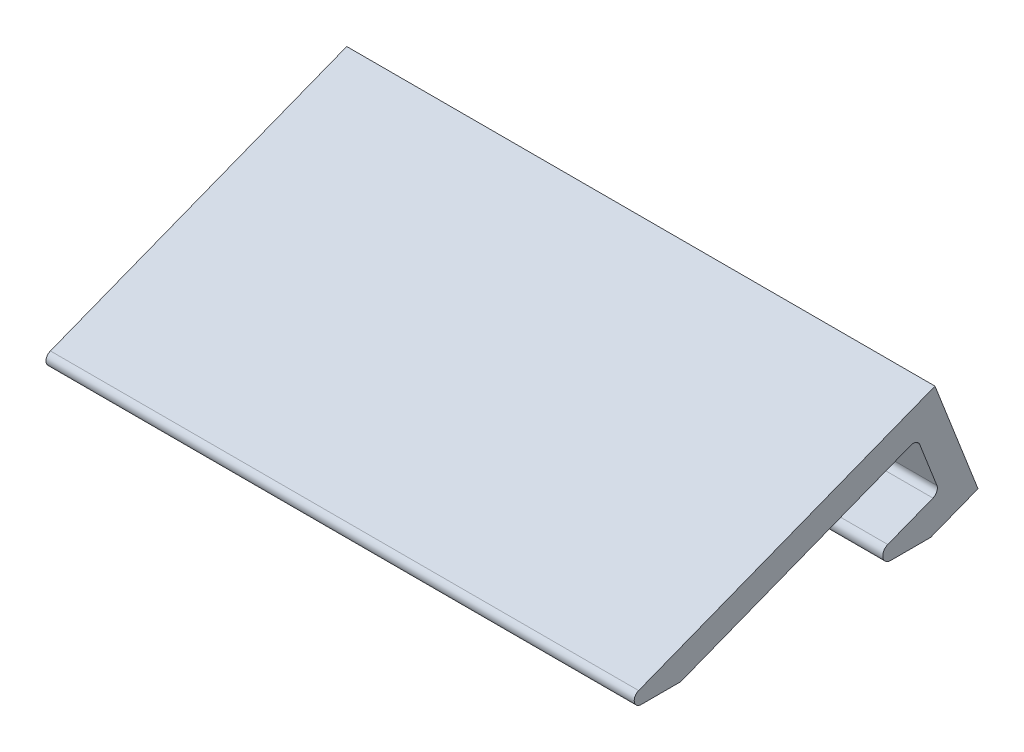
ISO-10303-21;
HEADER;
FILE_DESCRIPTION(('STEP AP214'),'2;1');
FILE_NAME('part.step','',(''),(''),'','','');
FILE_SCHEMA(('AUTOMOTIVE_DESIGN { 1 0 10303 214 1 1 1 1 }'));
ENDSEC;
DATA;
#1=APPLICATION_CONTEXT('core data for automotive mechanical design processes');
#2=APPLICATION_PROTOCOL_DEFINITION('international standard','automotive_design',2000,#1);
#3=PRODUCT_CONTEXT('',#1,'mechanical');
#4=PRODUCT('Part','Part','',(#3));
#5=PRODUCT_RELATED_PRODUCT_CATEGORY('part','',(#4));
#6=PRODUCT_DEFINITION_FORMATION('','',#4);
#7=PRODUCT_DEFINITION_CONTEXT('part definition',#1,'design');
#8=PRODUCT_DEFINITION('design','',#6,#7);
#9=PRODUCT_DEFINITION_SHAPE('','',#8);
#10=(LENGTH_UNIT() NAMED_UNIT(*) SI_UNIT(.MILLI.,.METRE.));
#11=(NAMED_UNIT(*) PLANE_ANGLE_UNIT() SI_UNIT($,.RADIAN.));
#12=(NAMED_UNIT(*) SI_UNIT($,.STERADIAN.) SOLID_ANGLE_UNIT());
#13=UNCERTAINTY_MEASURE_WITH_UNIT(LENGTH_MEASURE(1.E-05),#10,'distance_accuracy_value','');
#14=(GEOMETRIC_REPRESENTATION_CONTEXT(3) GLOBAL_UNCERTAINTY_ASSIGNED_CONTEXT((#13)) GLOBAL_UNIT_ASSIGNED_CONTEXT((#10,
#11,#12)) REPRESENTATION_CONTEXT('',''));
#15=CARTESIAN_POINT('',(0.,0.,0.));
#16=DIRECTION('',(0.,0.,1.));
#17=DIRECTION('',(1.,0.,0.));
#18=AXIS2_PLACEMENT_3D('',#15,#16,#17);
#19=CARTESIAN_POINT('',(849.,186.,-477.280680476412));
#20=DIRECTION('',(0.,-0.363108944921568,0.931746689888376));
#21=DIRECTION('',(0.,-0.931746689888376,-0.363108944921568));
#22=AXIS2_PLACEMENT_3D('',#19,#20,#21);
#23=PLANE('',#22);
#24=DIRECTION('',(0.,0.931746689888376,0.363108944921568));
#25=VECTOR('',#24,1.);
#26=CARTESIAN_POINT('',(0.,186.,-477.280680476412));
#27=LINE('',#26,#25);
#28=CARTESIAN_POINT('',(0.,26.6713160290877,-539.372310058));
#29=VERTEX_POINT('',#28);
#30=CARTESIAN_POINT('',(0.,186.,-477.280680476412));
#31=VERTEX_POINT('',#30);
#32=EDGE_CURVE('E154',#29,#31,#27,.T.);
#33=ORIENTED_EDGE('',*,*,#32,.T.);
#34=DIRECTION('',(-1.,0.,0.));
#35=VECTOR('',#34,1.);
#36=CARTESIAN_POINT('',(849.,186.,-477.280680476412));
#37=LINE('',#36,#35);
#38=CARTESIAN_POINT('',(849.,186.,-477.280680476412));
#39=VERTEX_POINT('',#38);
#40=EDGE_CURVE('E11',#39,#31,#37,.T.);
#41=ORIENTED_EDGE('',*,*,#40,.F.);
#42=DIRECTION('',(0.,0.931746689888376,0.363108944921568));
#43=VECTOR('',#42,1.);
#44=CARTESIAN_POINT('',(849.,186.,-477.280680476412));
#45=LINE('',#44,#43);
#46=CARTESIAN_POINT('',(849.,26.6713160290877,-539.372310058));
#47=VERTEX_POINT('',#46);
#48=EDGE_CURVE('E176',#47,#39,#45,.T.);
#49=ORIENTED_EDGE('',*,*,#48,.F.);
#50=DIRECTION('',(-1.,0.,0.));
#51=VECTOR('',#50,1.);
#52=CARTESIAN_POINT('',(849.,26.6713160290877,-539.372310058));
#53=LINE('',#52,#51);
#54=EDGE_CURVE('E150',#47,#29,#53,.T.);
#55=ORIENTED_EDGE('',*,*,#54,.T.);
#56=EDGE_LOOP('',(#33,#41,#49,#55));
#57=FACE_BOUND('',#56,.T.);
#58=ADVANCED_FACE('F34',(#57),#23,.F.);
#59=CARTESIAN_POINT('',(849.,19.3174668988837,-49.5691061644071));
#60=DIRECTION('',(0.,-0.931746689888376,-0.363108944921568));
#61=DIRECTION('',(0.,0.363108944921568,-0.931746689888376));
#62=AXIS2_PLACEMENT_3D('',#59,#60,#61);
#63=PLANE('',#62);
#64=DIRECTION('',(0.,-0.363108944921568,0.931746689888376));
#65=VECTOR('',#64,1.);
#66=CARTESIAN_POINT('',(0.,19.3174668988837,-49.5691061644071));
#67=LINE('',#66,#65);
#68=CARTESIAN_POINT('',(0.,19.3174668988837,-49.5691061644071));
#69=VERTEX_POINT('',#68);
#70=EDGE_CURVE('E157',#31,#69,#67,.T.);
#71=ORIENTED_EDGE('',*,*,#70,.T.);
#72=DIRECTION('',(-1.,0.,0.));
#73=VECTOR('',#72,1.);
#74=CARTESIAN_POINT('',(849.,19.3174668988837,-49.5691061644071));
#75=LINE('',#74,#73);
#76=CARTESIAN_POINT('',(849.,19.3174668988837,-49.5691061644071));
#77=VERTEX_POINT('',#76);
#78=EDGE_CURVE('E42',#77,#69,#75,.T.);
#79=ORIENTED_EDGE('',*,*,#78,.F.);
#80=DIRECTION('',(0.,-0.363108944921568,0.931746689888376));
#81=VECTOR('',#80,1.);
#82=CARTESIAN_POINT('',(849.,19.3174668988837,-49.5691061644071));
#83=LINE('',#82,#81);
#84=EDGE_CURVE('E105',#39,#77,#83,.T.);
#85=ORIENTED_EDGE('',*,*,#84,.F.);
#86=ORIENTED_EDGE('',*,*,#40,.T.);
#87=EDGE_LOOP('',(#71,#79,#85,#86));
#88=FACE_BOUND('',#87,.T.);
#89=ADVANCED_FACE('F254',(#88),#63,.F.);
#90=CARTESIAN_POINT('',(849.,9.99999999999991,-53.2001956136227));
#91=DIRECTION('',(-1.,0.,0.));
#92=DIRECTION('',(0.,0.,1.));
#93=AXIS2_PLACEMENT_3D('',#90,#91,#92);
#94=CYLINDRICAL_SURFACE('',#93,9.99999999999998);
#95=CARTESIAN_POINT('',(0.,9.99999999999991,-53.2001956136227));
#96=DIRECTION('',(1.,0.,0.));
#97=DIRECTION('',(0.,0.,-1.));
#98=AXIS2_PLACEMENT_3D('',#95,#96,#97);
#99=CIRCLE('',#98,9.99999999999998);
#100=CARTESIAN_POINT('',(0.,0.,-53.2001956136227));
#101=VERTEX_POINT('',#100);
#102=EDGE_CURVE('E159',#69,#101,#99,.T.);
#103=ORIENTED_EDGE('',*,*,#102,.T.);
#104=DIRECTION('',(-1.,0.,0.));
#105=VECTOR('',#104,1.);
#106=CARTESIAN_POINT('',(849.,0.,-53.2001956136227));
#107=LINE('',#106,#105);
#108=CARTESIAN_POINT('',(849.,0.,-53.2001956136227));
#109=VERTEX_POINT('',#108);
#110=EDGE_CURVE('E195',#109,#101,#107,.T.);
#111=ORIENTED_EDGE('',*,*,#110,.F.);
#112=CARTESIAN_POINT('',(849.,9.99999999999991,-53.2001956136227));
#113=DIRECTION('',(1.,0.,0.));
#114=DIRECTION('',(0.,0.,-1.));
#115=AXIS2_PLACEMENT_3D('',#112,#113,#114);
#116=CIRCLE('',#115,9.99999999999998);
#117=EDGE_CURVE('E203',#77,#109,#116,.T.);
#118=ORIENTED_EDGE('',*,*,#117,.F.);
#119=ORIENTED_EDGE('',*,*,#78,.T.);
#120=EDGE_LOOP('',(#103,#111,#118,#119));
#121=FACE_BOUND('',#120,.T.);
#122=ADVANCED_FACE('F201',(#121),#94,.T.);
#123=CARTESIAN_POINT('',(849.,0.,-110.159775900426));
#124=DIRECTION('',(0.,1.,0.));
#125=DIRECTION('',(0.,0.,1.));
#126=AXIS2_PLACEMENT_3D('',#123,#124,#125);
#127=PLANE('',#126);
#128=DIRECTION('',(0.,0.,-1.));
#129=VECTOR('',#128,1.);
#130=CARTESIAN_POINT('',(0.,0.,-110.159775900426));
#131=LINE('',#130,#129);
#132=CARTESIAN_POINT('',(0.,0.,-110.159775900426));
#133=VERTEX_POINT('',#132);
#134=EDGE_CURVE('E161',#101,#133,#131,.T.);
#135=ORIENTED_EDGE('',*,*,#134,.T.);
#136=DIRECTION('',(-1.,0.,0.));
#137=VECTOR('',#136,1.);
#138=CARTESIAN_POINT('',(849.,0.,-110.159775900426));
#139=LINE('',#138,#137);
#140=CARTESIAN_POINT('',(849.,0.,-110.159775900426));
#141=VERTEX_POINT('',#140);
#142=EDGE_CURVE('E192',#141,#133,#139,.T.);
#143=ORIENTED_EDGE('',*,*,#142,.F.);
#144=DIRECTION('',(0.,0.,-1.));
#145=VECTOR('',#144,1.);
#146=CARTESIAN_POINT('',(849.,0.,-110.159775900426));
#147=LINE('',#146,#145);
#148=EDGE_CURVE('E221',#109,#141,#147,.T.);
#149=ORIENTED_EDGE('',*,*,#148,.F.);
#150=ORIENTED_EDGE('',*,*,#110,.T.);
#151=EDGE_LOOP('',(#135,#143,#149,#150));
#152=FACE_BOUND('',#151,.T.);
#153=ADVANCED_FACE('F212',(#152),#127,.F.);
#154=CARTESIAN_POINT('',(849.,129.485358323622,-442.422463709191));
#155=DIRECTION('',(0.,0.931746689888376,0.363108944921568));
#156=DIRECTION('',(0.,-0.363108944921568,0.931746689888376));
#157=AXIS2_PLACEMENT_3D('',#154,#155,#156);
#158=PLANE('',#157);
#159=DIRECTION('',(0.,0.363108944921568,-0.931746689888376));
#160=VECTOR('',#159,1.);
#161=CARTESIAN_POINT('',(0.,129.485358323622,-442.422463709191));
#162=LINE('',#161,#160);
#163=CARTESIAN_POINT('',(0.,129.485358323622,-442.422463709191));
#164=VERTEX_POINT('',#163);
#165=EDGE_CURVE('E163',#133,#164,#162,.T.);
#166=ORIENTED_EDGE('',*,*,#165,.T.);
#167=DIRECTION('',(-1.,0.,0.));
#168=VECTOR('',#167,1.);
#169=CARTESIAN_POINT('',(849.,129.485358323622,-442.422463709191));
#170=LINE('',#169,#168);
#171=CARTESIAN_POINT('',(849.,129.485358323622,-442.422463709191));
#172=VERTEX_POINT('',#171);
#173=EDGE_CURVE('E189',#172,#164,#170,.T.);
#174=ORIENTED_EDGE('',*,*,#173,.F.);
#175=DIRECTION('',(0.,0.363108944921568,-0.931746689888376));
#176=VECTOR('',#175,1.);
#177=CARTESIAN_POINT('',(849.,129.485358323622,-442.422463709191));
#178=LINE('',#177,#176);
#179=EDGE_CURVE('E218',#141,#172,#178,.T.);
#180=ORIENTED_EDGE('',*,*,#179,.F.);
#181=ORIENTED_EDGE('',*,*,#142,.T.);
#182=EDGE_LOOP('',(#166,#174,#180,#181));
#183=FACE_BOUND('',#182,.T.);
#184=ADVANCED_FACE('F216',(#183),#158,.F.);
#185=CARTESIAN_POINT('',(849.,120.167891424738,-446.053553158406));
#186=DIRECTION('',(-1.,0.,0.));
#187=DIRECTION('',(0.,0.,1.));
#188=AXIS2_PLACEMENT_3D('',#185,#186,#187);
#189=CYLINDRICAL_SURFACE('',#188,9.99999999999997);
#190=CARTESIAN_POINT('',(0.,120.167891424738,-446.053553158406));
#191=DIRECTION('',(-1.,0.,0.));
#192=DIRECTION('',(0.,0.,-1.));
#193=AXIS2_PLACEMENT_3D('',#190,#191,#192);
#194=CIRCLE('',#193,9.99999999999997);
#195=CARTESIAN_POINT('',(0.,123.798980873954,-455.37102005729));
#196=VERTEX_POINT('',#195);
#197=EDGE_CURVE('E165',#164,#196,#194,.T.);
#198=ORIENTED_EDGE('',*,*,#197,.T.);
#199=DIRECTION('',(-1.,0.,0.));
#200=VECTOR('',#199,1.);
#201=CARTESIAN_POINT('',(849.,123.798980873954,-455.37102005729));
#202=LINE('',#201,#200);
#203=CARTESIAN_POINT('',(849.,123.798980873954,-455.37102005729));
#204=VERTEX_POINT('',#203);
#205=EDGE_CURVE('E186',#204,#196,#202,.T.);
#206=ORIENTED_EDGE('',*,*,#205,.F.);
#207=CARTESIAN_POINT('',(849.,120.167891424738,-446.053553158406));
#208=DIRECTION('',(-1.,0.,0.));
#209=DIRECTION('',(0.,0.,-1.));
#210=AXIS2_PLACEMENT_3D('',#207,#208,#209);
#211=CIRCLE('',#210,9.99999999999997);
#212=EDGE_CURVE('E220',#172,#204,#211,.T.);
#213=ORIENTED_EDGE('',*,*,#212,.F.);
#214=ORIENTED_EDGE('',*,*,#173,.T.);
#215=EDGE_LOOP('',(#198,#206,#213,#214));
#216=FACE_BOUND('',#215,.T.);
#217=ADVANCED_FACE('F267',(#216),#189,.F.);
#218=CARTESIAN_POINT('',(849.,60.4402059615443,-480.062428311957));
#219=DIRECTION('',(0.,0.363108944921569,-0.931746689888376));
#220=DIRECTION('',(0.,0.931746689888376,0.363108944921569));
#221=AXIS2_PLACEMENT_3D('',#218,#219,#220);
#222=PLANE('',#221);
#223=DIRECTION('',(0.,-0.931746689888376,-0.363108944921569));
#224=VECTOR('',#223,1.);
#225=CARTESIAN_POINT('',(0.,60.4402059615443,-480.062428311957));
#226=LINE('',#225,#224);
#227=CARTESIAN_POINT('',(0.,60.4402059615443,-480.062428311957));
#228=VERTEX_POINT('',#227);
#229=EDGE_CURVE('E167',#196,#228,#226,.T.);
#230=ORIENTED_EDGE('',*,*,#229,.T.);
#231=DIRECTION('',(-1.,0.,0.));
#232=VECTOR('',#231,1.);
#233=CARTESIAN_POINT('',(849.,60.4402059615443,-480.062428311957));
#234=LINE('',#233,#232);
#235=CARTESIAN_POINT('',(849.,60.4402059615443,-480.062428311957));
#236=VERTEX_POINT('',#235);
#237=EDGE_CURVE('E183',#236,#228,#234,.T.);
#238=ORIENTED_EDGE('',*,*,#237,.F.);
#239=DIRECTION('',(0.,-0.931746689888376,-0.363108944921569));
#240=VECTOR('',#239,1.);
#241=CARTESIAN_POINT('',(849.,60.4402059615443,-480.062428311957));
#242=LINE('',#241,#240);
#243=EDGE_CURVE('E223',#204,#236,#242,.T.);
#244=ORIENTED_EDGE('',*,*,#243,.F.);
#245=ORIENTED_EDGE('',*,*,#205,.T.);
#246=EDGE_LOOP('',(#230,#238,#244,#245));
#247=FACE_BOUND('',#246,.T.);
#248=ADVANCED_FACE('F270',(#247),#222,.F.);
#249=CARTESIAN_POINT('',(849.,56.8091165123285,-470.744961413073));
#250=DIRECTION('',(-1.,0.,0.));
#251=DIRECTION('',(0.,0.,1.));
#252=AXIS2_PLACEMENT_3D('',#249,#250,#251);
#253=CYLINDRICAL_SURFACE('',#252,10.);
#254=CARTESIAN_POINT('',(0.,56.8091165123285,-470.744961413073));
#255=DIRECTION('',(-1.,0.,0.));
#256=DIRECTION('',(0.,0.,-1.));
#257=AXIS2_PLACEMENT_3D('',#254,#255,#256);
#258=CIRCLE('',#257,10.);
#259=CARTESIAN_POINT('',(0.,47.4916496134447,-474.376050862289));
#260=VERTEX_POINT('',#259);
#261=EDGE_CURVE('E169',#228,#260,#258,.T.);
#262=ORIENTED_EDGE('',*,*,#261,.T.);
#263=DIRECTION('',(-1.,0.,0.));
#264=VECTOR('',#263,1.);
#265=CARTESIAN_POINT('',(849.,47.4916496134447,-474.376050862289));
#266=LINE('',#265,#264);
#267=CARTESIAN_POINT('',(849.,47.4916496134447,-474.376050862289));
#268=VERTEX_POINT('',#267);
#269=EDGE_CURVE('E180',#268,#260,#266,.T.);
#270=ORIENTED_EDGE('',*,*,#269,.F.);
#271=CARTESIAN_POINT('',(849.,56.8091165123285,-470.744961413073));
#272=DIRECTION('',(-1.,0.,0.));
#273=DIRECTION('',(0.,0.,-1.));
#274=AXIS2_PLACEMENT_3D('',#271,#272,#273);
#275=CIRCLE('',#274,10.);
#276=EDGE_CURVE('E229',#236,#268,#275,.T.);
#277=ORIENTED_EDGE('',*,*,#276,.F.);
#278=ORIENTED_EDGE('',*,*,#237,.T.);
#279=EDGE_LOOP('',(#262,#270,#277,#278));
#280=FACE_BOUND('',#279,.T.);
#281=ADVANCED_FACE('F235',(#280),#253,.F.);
#282=CARTESIAN_POINT('',(849.,22.0830946464051,-409.177059439756));
#283=DIRECTION('',(0.,-0.931746689888376,-0.363108944921568));
#284=DIRECTION('',(0.,0.363108944921568,-0.931746689888376));
#285=AXIS2_PLACEMENT_3D('',#282,#283,#284);
#286=PLANE('',#285);
#287=DIRECTION('',(0.,-0.363108944921568,0.931746689888376));
#288=VECTOR('',#287,1.);
#289=CARTESIAN_POINT('',(0.,22.0830946464051,-409.177059439756));
#290=LINE('',#289,#288);
#291=CARTESIAN_POINT('',(0.,22.0830946464051,-409.177059439756));
#292=VERTEX_POINT('',#291);
#293=EDGE_CURVE('E171',#260,#292,#290,.T.);
#294=ORIENTED_EDGE('',*,*,#293,.T.);
#295=DIRECTION('',(-1.,0.,0.));
#296=VECTOR('',#295,1.);
#297=CARTESIAN_POINT('',(849.,22.0830946464051,-409.177059439756));
#298=LINE('',#297,#296);
#299=CARTESIAN_POINT('',(849.,22.0830946464051,-409.177059439756));
#300=VERTEX_POINT('',#299);
#301=EDGE_CURVE('E145',#300,#292,#298,.T.);
#302=ORIENTED_EDGE('',*,*,#301,.F.);
#303=DIRECTION('',(0.,-0.363108944921568,0.931746689888376));
#304=VECTOR('',#303,1.);
#305=CARTESIAN_POINT('',(849.,22.0830946464051,-409.177059439756));
#306=LINE('',#305,#304);
#307=EDGE_CURVE('E136',#268,#300,#306,.T.);
#308=ORIENTED_EDGE('',*,*,#307,.F.);
#309=ORIENTED_EDGE('',*,*,#269,.T.);
#310=EDGE_LOOP('',(#294,#302,#308,#309));
#311=FACE_BOUND('',#310,.T.);
#312=ADVANCED_FACE('F239',(#311),#286,.F.);
#313=CARTESIAN_POINT('',(849.,11.4316720520335,-413.32800181726));
#314=DIRECTION('',(-1.,0.,0.));
#315=DIRECTION('',(0.,0.,1.));
#316=AXIS2_PLACEMENT_3D('',#313,#314,#315);
#317=CYLINDRICAL_SURFACE('',#316,11.4316720520334);
#318=CARTESIAN_POINT('',(0.,11.4316720520335,-413.32800181726));
#319=DIRECTION('',(1.,0.,0.));
#320=DIRECTION('',(0.,0.,1.));
#321=AXIS2_PLACEMENT_3D('',#318,#319,#320);
#322=CIRCLE('',#321,11.4316720520334);
#323=CARTESIAN_POINT('',(0.,0.,-413.32800181726));
#324=VERTEX_POINT('',#323);
#325=EDGE_CURVE('E144',#292,#324,#322,.T.);
#326=ORIENTED_EDGE('',*,*,#325,.T.);
#327=DIRECTION('',(-1.,0.,0.));
#328=VECTOR('',#327,1.);
#329=CARTESIAN_POINT('',(849.,0.,-413.32800181726));
#330=LINE('',#329,#328);
#331=CARTESIAN_POINT('',(849.,0.,-413.32800181726));
#332=VERTEX_POINT('',#331);
#333=EDGE_CURVE('E141',#332,#324,#330,.T.);
#334=ORIENTED_EDGE('',*,*,#333,.F.);
#335=CARTESIAN_POINT('',(849.,11.4316720520335,-413.32800181726));
#336=DIRECTION('',(1.,0.,0.));
#337=DIRECTION('',(0.,0.,1.));
#338=AXIS2_PLACEMENT_3D('',#335,#336,#337);
#339=CIRCLE('',#338,11.4316720520334);
#340=EDGE_CURVE('E130',#300,#332,#339,.T.);
#341=ORIENTED_EDGE('',*,*,#340,.F.);
#342=ORIENTED_EDGE('',*,*,#301,.T.);
#343=EDGE_LOOP('',(#326,#334,#341,#342));
#344=FACE_BOUND('',#343,.T.);
#345=ADVANCED_FACE('F142',(#344),#317,.T.);
#346=CARTESIAN_POINT('',(849.,0.,-470.933041974321));
#347=DIRECTION('',(0.,1.,0.));
#348=DIRECTION('',(0.,0.,1.));
#349=AXIS2_PLACEMENT_3D('',#346,#347,#348);
#350=PLANE('',#349);
#351=DIRECTION('',(0.,0.,-1.));
#352=VECTOR('',#351,1.);
#353=CARTESIAN_POINT('',(0.,0.,-470.933041974321));
#354=LINE('',#353,#352);
#355=CARTESIAN_POINT('',(0.,0.,-470.933041974321));
#356=VERTEX_POINT('',#355);
#357=EDGE_CURVE('E91',#324,#356,#354,.T.);
#358=ORIENTED_EDGE('',*,*,#357,.T.);
#359=DIRECTION('',(-1.,0.,0.));
#360=VECTOR('',#359,1.);
#361=CARTESIAN_POINT('',(849.,0.,-470.933041974321));
#362=LINE('',#361,#360);
#363=CARTESIAN_POINT('',(849.,0.,-470.933041974321));
#364=VERTEX_POINT('',#363);
#365=EDGE_CURVE('E146',#364,#356,#362,.T.);
#366=ORIENTED_EDGE('',*,*,#365,.F.);
#367=DIRECTION('',(0.,0.,-1.));
#368=VECTOR('',#367,1.);
#369=CARTESIAN_POINT('',(849.,0.,-470.933041974321));
#370=LINE('',#369,#368);
#371=EDGE_CURVE('E134',#332,#364,#370,.T.);
#372=ORIENTED_EDGE('',*,*,#371,.F.);
#373=ORIENTED_EDGE('',*,*,#333,.T.);
#374=EDGE_LOOP('',(#358,#366,#372,#373));
#375=FACE_BOUND('',#374,.T.);
#376=ADVANCED_FACE('F148',(#375),#350,.F.);
#377=CARTESIAN_POINT('',(849.,26.6713160290877,-539.372310058));
#378=DIRECTION('',(0.,0.931746689888376,0.363108944921568));
#379=DIRECTION('',(0.,-0.363108944921568,0.931746689888376));
#380=AXIS2_PLACEMENT_3D('',#377,#378,#379);
#381=PLANE('',#380);
#382=DIRECTION('',(0.,0.363108944921568,-0.931746689888376));
#383=VECTOR('',#382,1.);
#384=CARTESIAN_POINT('',(0.,26.6713160290877,-539.372310058));
#385=LINE('',#384,#383);
#386=EDGE_CURVE('E97',#356,#29,#385,.T.);
#387=ORIENTED_EDGE('',*,*,#386,.T.);
#388=ORIENTED_EDGE('',*,*,#54,.F.);
#389=DIRECTION('',(0.,0.363108944921568,-0.931746689888376));
#390=VECTOR('',#389,1.);
#391=CARTESIAN_POINT('',(849.,26.6713160290877,-539.372310058));
#392=LINE('',#391,#390);
#393=EDGE_CURVE('E50',#364,#47,#392,.T.);
#394=ORIENTED_EDGE('',*,*,#393,.F.);
#395=ORIENTED_EDGE('',*,*,#365,.T.);
#396=EDGE_LOOP('',(#387,#388,#394,#395));
#397=FACE_BOUND('',#396,.T.);
#398=ADVANCED_FACE('F243',(#397),#381,.F.);
#399=CARTESIAN_POINT('',(849.,11.4316720520335,-413.32800181726));
#400=DIRECTION('',(-1.,0.,0.));
#401=DIRECTION('',(0.,0.,1.));
#402=AXIS2_PLACEMENT_3D('',#399,#400,#401);
#403=PLANE('',#402);
#404=ORIENTED_EDGE('',*,*,#48,.T.);
#405=ORIENTED_EDGE('',*,*,#84,.T.);
#406=ORIENTED_EDGE('',*,*,#117,.T.);
#407=ORIENTED_EDGE('',*,*,#148,.T.);
#408=ORIENTED_EDGE('',*,*,#179,.T.);
#409=ORIENTED_EDGE('',*,*,#212,.T.);
#410=ORIENTED_EDGE('',*,*,#243,.T.);
#411=ORIENTED_EDGE('',*,*,#276,.T.);
#412=ORIENTED_EDGE('',*,*,#307,.T.);
#413=ORIENTED_EDGE('',*,*,#340,.T.);
#414=ORIENTED_EDGE('',*,*,#371,.T.);
#415=ORIENTED_EDGE('',*,*,#393,.T.);
#416=EDGE_LOOP('',(#404,#405,#406,#407,#408,#409,#410,#411,#412,#413,#414,#415));
#417=FACE_BOUND('',#416,.T.);
#418=ADVANCED_FACE('F132',(#417),#403,.F.);
#419=CARTESIAN_POINT('',(0.,11.4316720520335,-413.32800181726));
#420=DIRECTION('',(-1.,0.,0.));
#421=DIRECTION('',(0.,0.,1.));
#422=AXIS2_PLACEMENT_3D('',#419,#420,#421);
#423=PLANE('',#422);
#424=ORIENTED_EDGE('',*,*,#32,.F.);
#425=ORIENTED_EDGE('',*,*,#386,.F.);
#426=ORIENTED_EDGE('',*,*,#357,.F.);
#427=ORIENTED_EDGE('',*,*,#325,.F.);
#428=ORIENTED_EDGE('',*,*,#293,.F.);
#429=ORIENTED_EDGE('',*,*,#261,.F.);
#430=ORIENTED_EDGE('',*,*,#229,.F.);
#431=ORIENTED_EDGE('',*,*,#197,.F.);
#432=ORIENTED_EDGE('',*,*,#165,.F.);
#433=ORIENTED_EDGE('',*,*,#134,.F.);
#434=ORIENTED_EDGE('',*,*,#102,.F.);
#435=ORIENTED_EDGE('',*,*,#70,.F.);
#436=EDGE_LOOP('',(#424,#425,#426,#427,#428,#429,#430,#431,#432,#433,#434,#435));
#437=FACE_BOUND('',#436,.T.);
#438=ADVANCED_FACE('F207',(#437),#423,.T.);
#439=CLOSED_SHELL('',(#58,#89,#122,#153,#184,#217,#248,#281,#312,#345,#376,#398,#418,#438));
#440=MANIFOLD_SOLID_BREP('B2',#439);
#441=ADVANCED_BREP_SHAPE_REPRESENTATION('',(#18,#440),#14);
#442=SHAPE_DEFINITION_REPRESENTATION(#9,#441);
ENDSEC;
END-ISO-10303-21;
